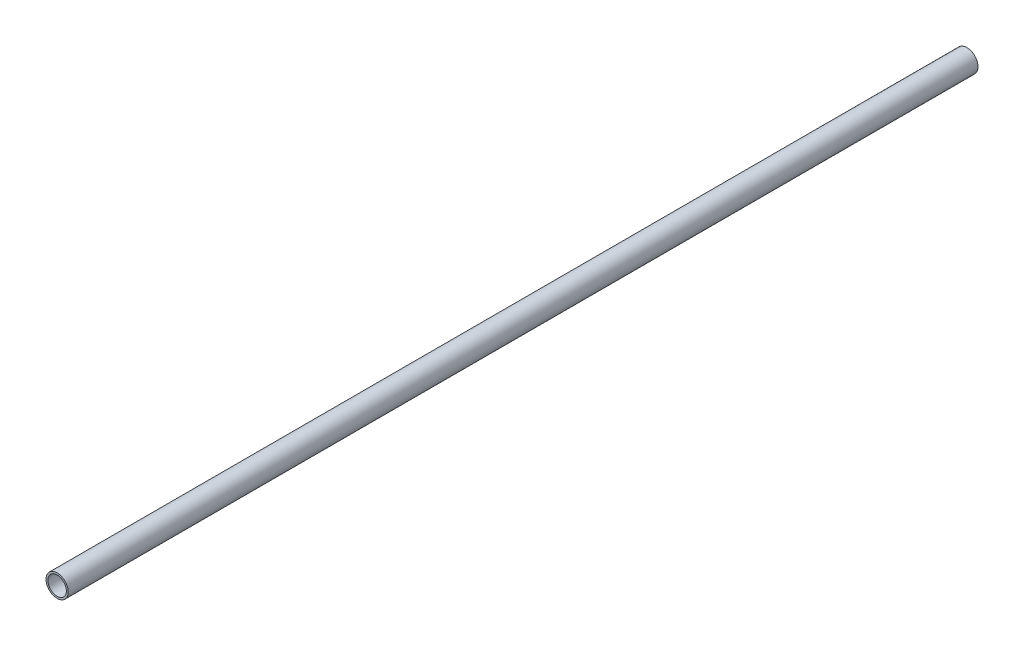
ISO-10303-21;
HEADER;
FILE_DESCRIPTION(('STEP AP214'),'2;1');
FILE_NAME('part.step','',(''),(''),'','','');
FILE_SCHEMA(('AUTOMOTIVE_DESIGN { 1 0 10303 214 1 1 1 1 }'));
ENDSEC;
DATA;
#1=APPLICATION_CONTEXT('core data for automotive mechanical design processes');
#2=APPLICATION_PROTOCOL_DEFINITION('international standard','automotive_design',2000,#1);
#3=PRODUCT_CONTEXT('',#1,'mechanical');
#4=PRODUCT('Part','Part','',(#3));
#5=PRODUCT_RELATED_PRODUCT_CATEGORY('part','',(#4));
#6=PRODUCT_DEFINITION_FORMATION('','',#4);
#7=PRODUCT_DEFINITION_CONTEXT('part definition',#1,'design');
#8=PRODUCT_DEFINITION('design','',#6,#7);
#9=PRODUCT_DEFINITION_SHAPE('','',#8);
#10=(LENGTH_UNIT() NAMED_UNIT(*) SI_UNIT(.MILLI.,.METRE.));
#11=(NAMED_UNIT(*) PLANE_ANGLE_UNIT() SI_UNIT($,.RADIAN.));
#12=(NAMED_UNIT(*) SI_UNIT($,.STERADIAN.) SOLID_ANGLE_UNIT());
#13=UNCERTAINTY_MEASURE_WITH_UNIT(LENGTH_MEASURE(1.E-05),#10,'distance_accuracy_value','');
#14=(GEOMETRIC_REPRESENTATION_CONTEXT(3) GLOBAL_UNCERTAINTY_ASSIGNED_CONTEXT((#13)) GLOBAL_UNIT_ASSIGNED_CONTEXT((#10,
#11,#12)) REPRESENTATION_CONTEXT('',''));
#15=CARTESIAN_POINT('',(0.,0.,0.));
#16=DIRECTION('',(0.,0.,1.));
#17=DIRECTION('',(1.,0.,0.));
#18=AXIS2_PLACEMENT_3D('',#15,#16,#17);
#19=CARTESIAN_POINT('',(0.,0.,0.));
#20=DIRECTION('',(0.,0.,1.));
#21=DIRECTION('',(1.,0.,0.));
#22=AXIS2_PLACEMENT_3D('',#19,#20,#21);
#23=CYLINDRICAL_SURFACE('',#22,17.526);
#24=CARTESIAN_POINT('',(0.,0.,1727.2));
#25=DIRECTION('',(0.,0.,1.));
#26=DIRECTION('',(1.,0.,0.));
#27=AXIS2_PLACEMENT_3D('',#24,#25,#26);
#28=CIRCLE('',#27,17.526);
#29=CARTESIAN_POINT('',(17.526,0.,1727.2));
#30=VERTEX_POINT('',#29);
#31=EDGE_CURVE('E9',#30,#30,#28,.T.);
#32=ORIENTED_EDGE('',*,*,#31,.T.);
#33=EDGE_LOOP('',(#32));
#34=FACE_BOUND('',#33,.T.);
#35=CARTESIAN_POINT('',(0.,0.,0.));
#36=DIRECTION('',(0.,0.,1.));
#37=DIRECTION('',(1.,0.,0.));
#38=AXIS2_PLACEMENT_3D('',#35,#36,#37);
#39=CIRCLE('',#38,17.526);
#40=CARTESIAN_POINT('',(17.526,0.,0.));
#41=VERTEX_POINT('',#40);
#42=EDGE_CURVE('E28',#41,#41,#39,.T.);
#43=ORIENTED_EDGE('',*,*,#42,.F.);
#44=EDGE_LOOP('',(#43));
#45=FACE_BOUND('',#44,.T.);
#46=ADVANCED_FACE('F14',(#34,#45),#23,.F.);
#47=CARTESIAN_POINT('',(0.,0.,0.));
#48=DIRECTION('',(0.,0.,1.));
#49=DIRECTION('',(1.,0.,0.));
#50=AXIS2_PLACEMENT_3D('',#47,#48,#49);
#51=CYLINDRICAL_SURFACE('',#50,21.082);
#52=CARTESIAN_POINT('',(0.,0.,1727.2));
#53=DIRECTION('',(0.,0.,-1.));
#54=DIRECTION('',(0.,-1.,0.));
#55=AXIS2_PLACEMENT_3D('',#52,#53,#54);
#56=CIRCLE('',#55,21.082);
#57=CARTESIAN_POINT('',(0.,-21.082,1727.2));
#58=VERTEX_POINT('',#57);
#59=EDGE_CURVE('E22',#58,#58,#56,.T.);
#60=ORIENTED_EDGE('',*,*,#59,.T.);
#61=EDGE_LOOP('',(#60));
#62=FACE_BOUND('',#61,.T.);
#63=CARTESIAN_POINT('',(0.,0.,0.));
#64=DIRECTION('',(0.,0.,-1.));
#65=DIRECTION('',(0.,-1.,0.));
#66=AXIS2_PLACEMENT_3D('',#63,#64,#65);
#67=CIRCLE('',#66,21.082);
#68=CARTESIAN_POINT('',(0.,-21.082,0.));
#69=VERTEX_POINT('',#68);
#70=EDGE_CURVE('E18',#69,#69,#67,.T.);
#71=ORIENTED_EDGE('',*,*,#70,.F.);
#72=EDGE_LOOP('',(#71));
#73=FACE_BOUND('',#72,.T.);
#74=ADVANCED_FACE('F16',(#62,#73),#51,.T.);
#75=CARTESIAN_POINT('',(0.,0.,0.));
#76=DIRECTION('',(0.,0.,1.));
#77=DIRECTION('',(1.,0.,0.));
#78=AXIS2_PLACEMENT_3D('',#75,#76,#77);
#79=PLANE('',#78);
#80=ORIENTED_EDGE('',*,*,#70,.T.);
#81=EDGE_LOOP('',(#80));
#82=FACE_BOUND('',#81,.T.);
#83=ORIENTED_EDGE('',*,*,#42,.T.);
#84=EDGE_LOOP('',(#83));
#85=FACE_BOUND('',#84,.T.);
#86=ADVANCED_FACE('F35',(#82,#85),#79,.F.);
#87=CARTESIAN_POINT('',(0.,0.,1727.2));
#88=DIRECTION('',(0.,0.,1.));
#89=DIRECTION('',(1.,0.,0.));
#90=AXIS2_PLACEMENT_3D('',#87,#88,#89);
#91=PLANE('',#90);
#92=ORIENTED_EDGE('',*,*,#59,.F.);
#93=EDGE_LOOP('',(#92));
#94=FACE_BOUND('',#93,.T.);
#95=ORIENTED_EDGE('',*,*,#31,.F.);
#96=EDGE_LOOP('',(#95));
#97=FACE_BOUND('',#96,.T.);
#98=ADVANCED_FACE('F44',(#94,#97),#91,.T.);
#99=CLOSED_SHELL('',(#46,#74,#86,#98));
#100=MANIFOLD_SOLID_BREP('B1',#99);
#101=ADVANCED_BREP_SHAPE_REPRESENTATION('',(#18,#100),#14);
#102=SHAPE_DEFINITION_REPRESENTATION(#9,#101);
ENDSEC;
END-ISO-10303-21;
